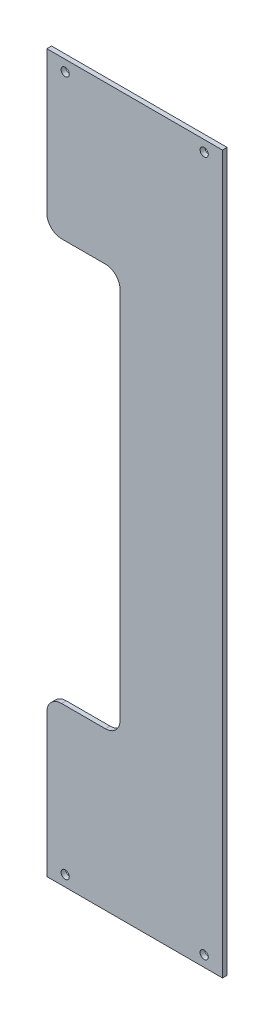
ISO-10303-21;
HEADER;
FILE_DESCRIPTION(('STEP AP214'),'2;1');
FILE_NAME('part.step','',(''),(''),'','','');
FILE_SCHEMA(('AUTOMOTIVE_DESIGN { 1 0 10303 214 1 1 1 1 }'));
ENDSEC;
DATA;
#1=APPLICATION_CONTEXT('core data for automotive mechanical design processes');
#2=APPLICATION_PROTOCOL_DEFINITION('international standard','automotive_design',2000,#1);
#3=PRODUCT_CONTEXT('',#1,'mechanical');
#4=PRODUCT('Part','Part','',(#3));
#5=PRODUCT_RELATED_PRODUCT_CATEGORY('part','',(#4));
#6=PRODUCT_DEFINITION_FORMATION('','',#4);
#7=PRODUCT_DEFINITION_CONTEXT('part definition',#1,'design');
#8=PRODUCT_DEFINITION('design','',#6,#7);
#9=PRODUCT_DEFINITION_SHAPE('','',#8);
#10=(LENGTH_UNIT() NAMED_UNIT(*) SI_UNIT(.MILLI.,.METRE.));
#11=(NAMED_UNIT(*) PLANE_ANGLE_UNIT() SI_UNIT($,.RADIAN.));
#12=(NAMED_UNIT(*) SI_UNIT($,.STERADIAN.) SOLID_ANGLE_UNIT());
#13=UNCERTAINTY_MEASURE_WITH_UNIT(LENGTH_MEASURE(1.E-05),#10,'distance_accuracy_value','');
#14=(GEOMETRIC_REPRESENTATION_CONTEXT(3) GLOBAL_UNCERTAINTY_ASSIGNED_CONTEXT((#13)) GLOBAL_UNIT_ASSIGNED_CONTEXT((#10,
#11,#12)) REPRESENTATION_CONTEXT('',''));
#15=CARTESIAN_POINT('',(0.,0.,0.));
#16=DIRECTION('',(0.,0.,1.));
#17=DIRECTION('',(1.,0.,0.));
#18=AXIS2_PLACEMENT_3D('',#15,#16,#17);
#19=CARTESIAN_POINT('',(-60.,-250.,3.175));
#20=DIRECTION('',(1.,0.,0.));
#21=DIRECTION('',(0.,0.,-1.));
#22=AXIS2_PLACEMENT_3D('',#19,#20,#21);
#23=PLANE('',#22);
#24=DIRECTION('',(0.,-1.,0.));
#25=VECTOR('',#24,1.);
#26=CARTESIAN_POINT('',(-60.,-250.,3.175));
#27=LINE('',#26,#25);
#28=CARTESIAN_POINT('',(-60.,245.,3.175));
#29=VERTEX_POINT('',#28);
#30=CARTESIAN_POINT('',(-60.,147.5,3.175));
#31=VERTEX_POINT('',#30);
#32=EDGE_CURVE('E148',#29,#31,#27,.T.);
#33=ORIENTED_EDGE('',*,*,#32,.F.);
#34=DIRECTION('',(0.,0.,1.));
#35=VECTOR('',#34,1.);
#36=CARTESIAN_POINT('',(-60.,245.,0.));
#37=LINE('',#36,#35);
#38=CARTESIAN_POINT('',(-60.,245.,0.));
#39=VERTEX_POINT('',#38);
#40=EDGE_CURVE('E135',#39,#29,#37,.T.);
#41=ORIENTED_EDGE('',*,*,#40,.F.);
#42=DIRECTION('',(0.,-1.,0.));
#43=VECTOR('',#42,1.);
#44=CARTESIAN_POINT('',(-60.,-250.,0.));
#45=LINE('',#44,#43);
#46=CARTESIAN_POINT('',(-60.,147.5,0.));
#47=VERTEX_POINT('',#46);
#48=EDGE_CURVE('E146',#39,#47,#45,.T.);
#49=ORIENTED_EDGE('',*,*,#48,.T.);
#50=DIRECTION('',(0.,0.,1.));
#51=VECTOR('',#50,1.);
#52=CARTESIAN_POINT('',(-60.,147.5,3.175));
#53=LINE('',#52,#51);
#54=EDGE_CURVE('E185',#47,#31,#53,.T.);
#55=ORIENTED_EDGE('',*,*,#54,.T.);
#56=EDGE_LOOP('',(#33,#41,#49,#55));
#57=FACE_BOUND('',#56,.T.);
#58=ADVANCED_FACE('F45',(#57),#23,.F.);
#59=CARTESIAN_POINT('',(0.,0.,3.175));
#60=DIRECTION('',(0.,0.,-1.));
#61=DIRECTION('',(-1.,0.,0.));
#62=AXIS2_PLACEMENT_3D('',#59,#60,#61);
#63=PLANE('',#62);
#64=DIRECTION('',(0.,1.,0.));
#65=VECTOR('',#64,1.);
#66=CARTESIAN_POINT('',(60.,-250.,3.175));
#67=LINE('',#66,#65);
#68=CARTESIAN_POINT('',(60.,-245.,3.175));
#69=VERTEX_POINT('',#68);
#70=CARTESIAN_POINT('',(60.,245.,3.175));
#71=VERTEX_POINT('',#70);
#72=EDGE_CURVE('E168',#69,#71,#67,.T.);
#73=ORIENTED_EDGE('',*,*,#72,.T.);
#74=DIRECTION('',(1.,0.,0.));
#75=VECTOR('',#74,1.);
#76=CARTESIAN_POINT('',(-60.,245.,3.175));
#77=LINE('',#76,#75);
#78=EDGE_CURVE('E61',#29,#71,#77,.T.);
#79=ORIENTED_EDGE('',*,*,#78,.F.);
#80=ORIENTED_EDGE('',*,*,#32,.T.);
#81=CARTESIAN_POINT('',(-50.,147.5,3.175));
#82=DIRECTION('',(0.,0.,-1.));
#83=DIRECTION('',(-1.,0.,0.));
#84=AXIS2_PLACEMENT_3D('',#81,#82,#83);
#85=CIRCLE('',#84,10.);
#86=CARTESIAN_POINT('',(-50.,137.5,3.175));
#87=VERTEX_POINT('',#86);
#88=EDGE_CURVE('E191',#31,#87,#85,.F.);
#89=ORIENTED_EDGE('',*,*,#88,.T.);
#90=DIRECTION('',(-1.,0.,0.));
#91=VECTOR('',#90,1.);
#92=CARTESIAN_POINT('',(-60.,137.5,3.175));
#93=LINE('',#92,#91);
#94=CARTESIAN_POINT('',(-20.,137.5,3.175));
#95=VERTEX_POINT('',#94);
#96=EDGE_CURVE('E252',#95,#87,#93,.T.);
#97=ORIENTED_EDGE('',*,*,#96,.F.);
#98=CARTESIAN_POINT('',(-20.,127.5,3.175));
#99=DIRECTION('',(0.,0.,-1.));
#100=DIRECTION('',(-1.,0.,0.));
#101=AXIS2_PLACEMENT_3D('',#98,#99,#100);
#102=CIRCLE('',#101,10.);
#103=CARTESIAN_POINT('',(-9.99999999999997,127.5,3.175));
#104=VERTEX_POINT('',#103);
#105=EDGE_CURVE('E209',#95,#104,#102,.T.);
#106=ORIENTED_EDGE('',*,*,#105,.T.);
#107=DIRECTION('',(0.,1.,0.));
#108=VECTOR('',#107,1.);
#109=CARTESIAN_POINT('',(-9.99999999999997,137.5,3.175));
#110=LINE('',#109,#108);
#111=CARTESIAN_POINT('',(-9.99999999999995,-127.5,3.175));
#112=VERTEX_POINT('',#111);
#113=EDGE_CURVE('E224',#112,#104,#110,.T.);
#114=ORIENTED_EDGE('',*,*,#113,.F.);
#115=CARTESIAN_POINT('',(-20.,-127.5,3.175));
#116=DIRECTION('',(0.,0.,-1.));
#117=DIRECTION('',(-1.,0.,0.));
#118=AXIS2_PLACEMENT_3D('',#115,#116,#117);
#119=CIRCLE('',#118,10.);
#120=CARTESIAN_POINT('',(-19.9999999999999,-137.5,3.175));
#121=VERTEX_POINT('',#120);
#122=EDGE_CURVE('E54',#112,#121,#119,.T.);
#123=ORIENTED_EDGE('',*,*,#122,.T.);
#124=DIRECTION('',(1.,0.,0.));
#125=VECTOR('',#124,1.);
#126=CARTESIAN_POINT('',(-60.,-137.5,3.175));
#127=LINE('',#126,#125);
#128=CARTESIAN_POINT('',(-50.,-137.5,3.175));
#129=VERTEX_POINT('',#128);
#130=EDGE_CURVE('E222',#129,#121,#127,.T.);
#131=ORIENTED_EDGE('',*,*,#130,.F.);
#132=CARTESIAN_POINT('',(-50.,-147.5,3.175));
#133=DIRECTION('',(0.,0.,-1.));
#134=DIRECTION('',(-1.,0.,0.));
#135=AXIS2_PLACEMENT_3D('',#132,#133,#134);
#136=CIRCLE('',#135,10.);
#137=CARTESIAN_POINT('',(-60.,-147.5,3.175));
#138=VERTEX_POINT('',#137);
#139=EDGE_CURVE('E188',#129,#138,#136,.F.);
#140=ORIENTED_EDGE('',*,*,#139,.T.);
#141=CARTESIAN_POINT('',(-60.,-245.,3.175));
#142=VERTEX_POINT('',#141);
#143=EDGE_CURVE('E163',#138,#142,#27,.T.);
#144=ORIENTED_EDGE('',*,*,#143,.T.);
#145=DIRECTION('',(-1.,0.,0.));
#146=VECTOR('',#145,1.);
#147=CARTESIAN_POINT('',(-60.,-245.,3.175));
#148=LINE('',#147,#146);
#149=EDGE_CURVE('E297',#69,#142,#148,.T.);
#150=ORIENTED_EDGE('',*,*,#149,.F.);
#151=EDGE_LOOP('',(#73,#79,#80,#89,#97,#106,#114,#123,#131,#140,#144,#150));
#152=FACE_BOUND('',#151,.T.);
#153=CARTESIAN_POINT('',(-47.5,-237.5,3.175));
#154=DIRECTION('',(0.,0.,1.));
#155=DIRECTION('',(1.,0.,0.));
#156=AXIS2_PLACEMENT_3D('',#153,#154,#155);
#157=CIRCLE('',#156,2.8);
#158=CARTESIAN_POINT('',(-44.7,-237.5,3.175));
#159=VERTEX_POINT('',#158);
#160=EDGE_CURVE('E166',#159,#159,#157,.T.);
#161=ORIENTED_EDGE('',*,*,#160,.F.);
#162=EDGE_LOOP('',(#161));
#163=FACE_BOUND('',#162,.T.);
#164=CARTESIAN_POINT('',(47.5,-237.5,3.175));
#165=DIRECTION('',(0.,0.,1.));
#166=DIRECTION('',(1.,0.,0.));
#167=AXIS2_PLACEMENT_3D('',#164,#165,#166);
#168=CIRCLE('',#167,2.8);
#169=CARTESIAN_POINT('',(50.3,-237.5,3.175));
#170=VERTEX_POINT('',#169);
#171=EDGE_CURVE('E277',#170,#170,#168,.T.);
#172=ORIENTED_EDGE('',*,*,#171,.F.);
#173=EDGE_LOOP('',(#172));
#174=FACE_BOUND('',#173,.T.);
#175=CARTESIAN_POINT('',(-47.5,237.5,3.175));
#176=DIRECTION('',(0.,0.,1.));
#177=DIRECTION('',(1.,0.,0.));
#178=AXIS2_PLACEMENT_3D('',#175,#176,#177);
#179=CIRCLE('',#178,2.8);
#180=CARTESIAN_POINT('',(-44.7,237.5,3.175));
#181=VERTEX_POINT('',#180);
#182=EDGE_CURVE('E269',#181,#181,#179,.T.);
#183=ORIENTED_EDGE('',*,*,#182,.F.);
#184=EDGE_LOOP('',(#183));
#185=FACE_BOUND('',#184,.T.);
#186=CARTESIAN_POINT('',(47.5,237.5,3.175));
#187=DIRECTION('',(0.,0.,1.));
#188=DIRECTION('',(1.,0.,0.));
#189=AXIS2_PLACEMENT_3D('',#186,#187,#188);
#190=CIRCLE('',#189,2.8);
#191=CARTESIAN_POINT('',(50.3,237.5,3.175));
#192=VERTEX_POINT('',#191);
#193=EDGE_CURVE('E261',#192,#192,#190,.T.);
#194=ORIENTED_EDGE('',*,*,#193,.F.);
#195=EDGE_LOOP('',(#194));
#196=FACE_BOUND('',#195,.T.);
#197=ADVANCED_FACE('F220',(#152,#163,#174,#185,#196),#63,.F.);
#198=CARTESIAN_POINT('',(0.,0.,0.));
#199=DIRECTION('',(0.,0.,-1.));
#200=DIRECTION('',(-1.,0.,0.));
#201=AXIS2_PLACEMENT_3D('',#198,#199,#200);
#202=PLANE('',#201);
#203=DIRECTION('',(1.,0.,0.));
#204=VECTOR('',#203,1.);
#205=CARTESIAN_POINT('',(-60.,245.,0.));
#206=LINE('',#205,#204);
#207=CARTESIAN_POINT('',(60.,245.,0.));
#208=VERTEX_POINT('',#207);
#209=EDGE_CURVE('E132',#39,#208,#206,.T.);
#210=ORIENTED_EDGE('',*,*,#209,.T.);
#211=DIRECTION('',(0.,1.,0.));
#212=VECTOR('',#211,1.);
#213=CARTESIAN_POINT('',(60.,-250.,0.));
#214=LINE('',#213,#212);
#215=CARTESIAN_POINT('',(60.,-245.,0.));
#216=VERTEX_POINT('',#215);
#217=EDGE_CURVE('E158',#216,#208,#214,.T.);
#218=ORIENTED_EDGE('',*,*,#217,.F.);
#219=DIRECTION('',(-1.,0.,0.));
#220=VECTOR('',#219,1.);
#221=CARTESIAN_POINT('',(-60.,-245.,0.));
#222=LINE('',#221,#220);
#223=CARTESIAN_POINT('',(-60.,-245.,0.));
#224=VERTEX_POINT('',#223);
#225=EDGE_CURVE('E69',#216,#224,#222,.T.);
#226=ORIENTED_EDGE('',*,*,#225,.T.);
#227=CARTESIAN_POINT('',(-60.,-147.5,0.));
#228=VERTEX_POINT('',#227);
#229=EDGE_CURVE('E159',#228,#224,#45,.T.);
#230=ORIENTED_EDGE('',*,*,#229,.F.);
#231=CARTESIAN_POINT('',(-50.,-147.5,0.));
#232=DIRECTION('',(0.,0.,-1.));
#233=DIRECTION('',(-1.,0.,0.));
#234=AXIS2_PLACEMENT_3D('',#231,#232,#233);
#235=CIRCLE('',#234,10.);
#236=CARTESIAN_POINT('',(-50.,-137.5,0.));
#237=VERTEX_POINT('',#236);
#238=EDGE_CURVE('E194',#228,#237,#235,.T.);
#239=ORIENTED_EDGE('',*,*,#238,.T.);
#240=DIRECTION('',(1.,0.,0.));
#241=VECTOR('',#240,1.);
#242=CARTESIAN_POINT('',(-60.,-137.5,0.));
#243=LINE('',#242,#241);
#244=CARTESIAN_POINT('',(-19.9999999999999,-137.5,0.));
#245=VERTEX_POINT('',#244);
#246=EDGE_CURVE('E241',#237,#245,#243,.T.);
#247=ORIENTED_EDGE('',*,*,#246,.T.);
#248=CARTESIAN_POINT('',(-20.,-127.5,0.));
#249=DIRECTION('',(0.,0.,-1.));
#250=DIRECTION('',(-1.,0.,0.));
#251=AXIS2_PLACEMENT_3D('',#248,#249,#250);
#252=CIRCLE('',#251,10.);
#253=CARTESIAN_POINT('',(-9.99999999999995,-127.5,0.));
#254=VERTEX_POINT('',#253);
#255=EDGE_CURVE('E11',#245,#254,#252,.F.);
#256=ORIENTED_EDGE('',*,*,#255,.T.);
#257=DIRECTION('',(0.,1.,0.));
#258=VECTOR('',#257,1.);
#259=CARTESIAN_POINT('',(-9.99999999999997,137.5,0.));
#260=LINE('',#259,#258);
#261=CARTESIAN_POINT('',(-9.99999999999997,127.5,0.));
#262=VERTEX_POINT('',#261);
#263=EDGE_CURVE('E239',#254,#262,#260,.T.);
#264=ORIENTED_EDGE('',*,*,#263,.T.);
#265=CARTESIAN_POINT('',(-20.,127.5,0.));
#266=DIRECTION('',(0.,0.,-1.));
#267=DIRECTION('',(-1.,0.,0.));
#268=AXIS2_PLACEMENT_3D('',#265,#266,#267);
#269=CIRCLE('',#268,10.);
#270=CARTESIAN_POINT('',(-20.,137.5,0.));
#271=VERTEX_POINT('',#270);
#272=EDGE_CURVE('E212',#262,#271,#269,.F.);
#273=ORIENTED_EDGE('',*,*,#272,.T.);
#274=DIRECTION('',(-1.,0.,0.));
#275=VECTOR('',#274,1.);
#276=CARTESIAN_POINT('',(-60.,137.5,0.));
#277=LINE('',#276,#275);
#278=CARTESIAN_POINT('',(-50.,137.5,0.));
#279=VERTEX_POINT('',#278);
#280=EDGE_CURVE('E246',#271,#279,#277,.T.);
#281=ORIENTED_EDGE('',*,*,#280,.T.);
#282=CARTESIAN_POINT('',(-50.,147.5,0.));
#283=DIRECTION('',(0.,0.,-1.));
#284=DIRECTION('',(-1.,0.,0.));
#285=AXIS2_PLACEMENT_3D('',#282,#283,#284);
#286=CIRCLE('',#285,10.);
#287=EDGE_CURVE('E155',#279,#47,#286,.T.);
#288=ORIENTED_EDGE('',*,*,#287,.T.);
#289=ORIENTED_EDGE('',*,*,#48,.F.);
#290=EDGE_LOOP('',(#210,#218,#226,#230,#239,#247,#256,#264,#273,#281,#288,#289));
#291=FACE_BOUND('',#290,.T.);
#292=CARTESIAN_POINT('',(-47.5,237.5,0.));
#293=DIRECTION('',(0.,0.,1.));
#294=DIRECTION('',(1.,0.,0.));
#295=AXIS2_PLACEMENT_3D('',#292,#293,#294);
#296=CIRCLE('',#295,2.8);
#297=CARTESIAN_POINT('',(-44.7,237.5,0.));
#298=VERTEX_POINT('',#297);
#299=EDGE_CURVE('E265',#298,#298,#296,.T.);
#300=ORIENTED_EDGE('',*,*,#299,.T.);
#301=EDGE_LOOP('',(#300));
#302=FACE_BOUND('',#301,.T.);
#303=CARTESIAN_POINT('',(-47.5,-237.5,0.));
#304=DIRECTION('',(0.,0.,1.));
#305=DIRECTION('',(1.,0.,0.));
#306=AXIS2_PLACEMENT_3D('',#303,#304,#305);
#307=CIRCLE('',#306,2.8);
#308=CARTESIAN_POINT('',(-44.7,-237.5,0.));
#309=VERTEX_POINT('',#308);
#310=EDGE_CURVE('E281',#309,#309,#307,.T.);
#311=ORIENTED_EDGE('',*,*,#310,.T.);
#312=EDGE_LOOP('',(#311));
#313=FACE_BOUND('',#312,.T.);
#314=CARTESIAN_POINT('',(47.5,-237.5,0.));
#315=DIRECTION('',(0.,0.,1.));
#316=DIRECTION('',(1.,0.,0.));
#317=AXIS2_PLACEMENT_3D('',#314,#315,#316);
#318=CIRCLE('',#317,2.8);
#319=CARTESIAN_POINT('',(50.3,-237.5,0.));
#320=VERTEX_POINT('',#319);
#321=EDGE_CURVE('E273',#320,#320,#318,.T.);
#322=ORIENTED_EDGE('',*,*,#321,.T.);
#323=EDGE_LOOP('',(#322));
#324=FACE_BOUND('',#323,.T.);
#325=CARTESIAN_POINT('',(47.5,237.5,0.));
#326=DIRECTION('',(0.,0.,1.));
#327=DIRECTION('',(1.,0.,0.));
#328=AXIS2_PLACEMENT_3D('',#325,#326,#327);
#329=CIRCLE('',#328,2.8);
#330=CARTESIAN_POINT('',(50.3,237.5,0.));
#331=VERTEX_POINT('',#330);
#332=EDGE_CURVE('E250',#331,#331,#329,.T.);
#333=ORIENTED_EDGE('',*,*,#332,.T.);
#334=EDGE_LOOP('',(#333));
#335=FACE_BOUND('',#334,.T.);
#336=ADVANCED_FACE('F151',(#291,#302,#313,#324,#335),#202,.T.);
#337=ORIENTED_EDGE('',*,*,#229,.T.);
#338=DIRECTION('',(0.,0.,1.));
#339=VECTOR('',#338,1.);
#340=CARTESIAN_POINT('',(-60.,-245.,0.));
#341=LINE('',#340,#339);
#342=EDGE_CURVE('E304',#224,#142,#341,.T.);
#343=ORIENTED_EDGE('',*,*,#342,.T.);
#344=ORIENTED_EDGE('',*,*,#143,.F.);
#345=DIRECTION('',(0.,0.,1.));
#346=VECTOR('',#345,1.);
#347=CARTESIAN_POINT('',(-60.,-147.5,3.175));
#348=LINE('',#347,#346);
#349=EDGE_CURVE('E206',#138,#228,#348,.F.);
#350=ORIENTED_EDGE('',*,*,#349,.T.);
#351=EDGE_LOOP('',(#337,#343,#344,#350));
#352=FACE_BOUND('',#351,.T.);
#353=ADVANCED_FACE('F302',(#352),#23,.F.);
#354=CARTESIAN_POINT('',(60.,-250.,3.175));
#355=DIRECTION('',(-1.,0.,0.));
#356=DIRECTION('',(0.,0.,1.));
#357=AXIS2_PLACEMENT_3D('',#354,#355,#356);
#358=PLANE('',#357);
#359=ORIENTED_EDGE('',*,*,#217,.T.);
#360=DIRECTION('',(0.,0.,1.));
#361=VECTOR('',#360,1.);
#362=CARTESIAN_POINT('',(60.,245.,0.));
#363=LINE('',#362,#361);
#364=EDGE_CURVE('E136',#208,#71,#363,.T.);
#365=ORIENTED_EDGE('',*,*,#364,.T.);
#366=ORIENTED_EDGE('',*,*,#72,.F.);
#367=DIRECTION('',(0.,0.,1.));
#368=VECTOR('',#367,1.);
#369=CARTESIAN_POINT('',(60.,-245.,0.));
#370=LINE('',#369,#368);
#371=EDGE_CURVE('E308',#216,#69,#370,.T.);
#372=ORIENTED_EDGE('',*,*,#371,.F.);
#373=EDGE_LOOP('',(#359,#365,#366,#372));
#374=FACE_BOUND('',#373,.T.);
#375=ADVANCED_FACE('F320',(#374),#358,.F.);
#376=CARTESIAN_POINT('',(-47.5,-237.5,3.175));
#377=DIRECTION('',(0.,0.,-1.));
#378=DIRECTION('',(-1.,0.,0.));
#379=AXIS2_PLACEMENT_3D('',#376,#377,#378);
#380=CYLINDRICAL_SURFACE('',#379,2.8);
#381=ORIENTED_EDGE('',*,*,#160,.T.);
#382=EDGE_LOOP('',(#381));
#383=FACE_BOUND('',#382,.T.);
#384=ORIENTED_EDGE('',*,*,#310,.F.);
#385=EDGE_LOOP('',(#384));
#386=FACE_BOUND('',#385,.T.);
#387=ADVANCED_FACE('F343',(#383,#386),#380,.F.);
#388=CARTESIAN_POINT('',(47.5,-237.5,3.175));
#389=DIRECTION('',(0.,0.,-1.));
#390=DIRECTION('',(-1.,0.,0.));
#391=AXIS2_PLACEMENT_3D('',#388,#389,#390);
#392=CYLINDRICAL_SURFACE('',#391,2.8);
#393=ORIENTED_EDGE('',*,*,#171,.T.);
#394=EDGE_LOOP('',(#393));
#395=FACE_BOUND('',#394,.T.);
#396=ORIENTED_EDGE('',*,*,#321,.F.);
#397=EDGE_LOOP('',(#396));
#398=FACE_BOUND('',#397,.T.);
#399=ADVANCED_FACE('F350',(#395,#398),#392,.F.);
#400=CARTESIAN_POINT('',(-47.5,237.5,3.175));
#401=DIRECTION('',(0.,0.,-1.));
#402=DIRECTION('',(-1.,0.,0.));
#403=AXIS2_PLACEMENT_3D('',#400,#401,#402);
#404=CYLINDRICAL_SURFACE('',#403,2.8);
#405=ORIENTED_EDGE('',*,*,#182,.T.);
#406=EDGE_LOOP('',(#405));
#407=FACE_BOUND('',#406,.T.);
#408=ORIENTED_EDGE('',*,*,#299,.F.);
#409=EDGE_LOOP('',(#408));
#410=FACE_BOUND('',#409,.T.);
#411=ADVANCED_FACE('F354',(#407,#410),#404,.F.);
#412=CARTESIAN_POINT('',(47.5,237.5,3.175));
#413=DIRECTION('',(0.,0.,-1.));
#414=DIRECTION('',(-1.,0.,0.));
#415=AXIS2_PLACEMENT_3D('',#412,#413,#414);
#416=CYLINDRICAL_SURFACE('',#415,2.8);
#417=ORIENTED_EDGE('',*,*,#193,.T.);
#418=EDGE_LOOP('',(#417));
#419=FACE_BOUND('',#418,.T.);
#420=ORIENTED_EDGE('',*,*,#332,.F.);
#421=EDGE_LOOP('',(#420));
#422=FACE_BOUND('',#421,.T.);
#423=ADVANCED_FACE('F358',(#419,#422),#416,.F.);
#424=CARTESIAN_POINT('',(-60.,137.5,0.));
#425=DIRECTION('',(0.,1.,0.));
#426=DIRECTION('',(0.,0.,1.));
#427=AXIS2_PLACEMENT_3D('',#424,#425,#426);
#428=PLANE('',#427);
#429=ORIENTED_EDGE('',*,*,#280,.F.);
#430=DIRECTION('',(0.,0.,1.));
#431=VECTOR('',#430,1.);
#432=CARTESIAN_POINT('',(-20.,137.5,3.175));
#433=LINE('',#432,#431);
#434=EDGE_CURVE('E174',#271,#95,#433,.T.);
#435=ORIENTED_EDGE('',*,*,#434,.T.);
#436=ORIENTED_EDGE('',*,*,#96,.T.);
#437=DIRECTION('',(0.,0.,1.));
#438=VECTOR('',#437,1.);
#439=CARTESIAN_POINT('',(-50.,137.5,0.));
#440=LINE('',#439,#438);
#441=EDGE_CURVE('E171',#87,#279,#440,.F.);
#442=ORIENTED_EDGE('',*,*,#441,.T.);
#443=EDGE_LOOP('',(#429,#435,#436,#442));
#444=FACE_BOUND('',#443,.T.);
#445=ADVANCED_FACE('F362',(#444),#428,.F.);
#446=CARTESIAN_POINT('',(-9.99999999999997,137.5,0.));
#447=DIRECTION('',(1.,0.,0.));
#448=DIRECTION('',(0.,1.,0.));
#449=AXIS2_PLACEMENT_3D('',#446,#447,#448);
#450=PLANE('',#449);
#451=ORIENTED_EDGE('',*,*,#113,.T.);
#452=DIRECTION('',(0.,0.,1.));
#453=VECTOR('',#452,1.);
#454=CARTESIAN_POINT('',(-9.99999999999997,127.5,0.));
#455=LINE('',#454,#453);
#456=EDGE_CURVE('E182',#104,#262,#455,.F.);
#457=ORIENTED_EDGE('',*,*,#456,.T.);
#458=ORIENTED_EDGE('',*,*,#263,.F.);
#459=DIRECTION('',(0.,0.,1.));
#460=VECTOR('',#459,1.);
#461=CARTESIAN_POINT('',(-9.99999999999995,-127.5,3.175));
#462=LINE('',#461,#460);
#463=EDGE_CURVE('E178',#254,#112,#462,.T.);
#464=ORIENTED_EDGE('',*,*,#463,.T.);
#465=EDGE_LOOP('',(#451,#457,#458,#464));
#466=FACE_BOUND('',#465,.T.);
#467=ADVANCED_FACE('F243',(#466),#450,.F.);
#468=CARTESIAN_POINT('',(-60.,-137.5,0.));
#469=DIRECTION('',(0.,-1.,0.));
#470=DIRECTION('',(0.,0.,-1.));
#471=AXIS2_PLACEMENT_3D('',#468,#469,#470);
#472=PLANE('',#471);
#473=ORIENTED_EDGE('',*,*,#130,.T.);
#474=DIRECTION('',(0.,0.,1.));
#475=VECTOR('',#474,1.);
#476=CARTESIAN_POINT('',(-20.,-137.5,0.));
#477=LINE('',#476,#475);
#478=EDGE_CURVE('E203',#121,#245,#477,.F.);
#479=ORIENTED_EDGE('',*,*,#478,.T.);
#480=ORIENTED_EDGE('',*,*,#246,.F.);
#481=DIRECTION('',(0.,0.,1.));
#482=VECTOR('',#481,1.);
#483=CARTESIAN_POINT('',(-50.,-137.5,0.));
#484=LINE('',#483,#482);
#485=EDGE_CURVE('E199',#237,#129,#484,.T.);
#486=ORIENTED_EDGE('',*,*,#485,.T.);
#487=EDGE_LOOP('',(#473,#479,#480,#486));
#488=FACE_BOUND('',#487,.T.);
#489=ADVANCED_FACE('F229',(#488),#472,.F.);
#490=CARTESIAN_POINT('',(-20.,127.5,0.));
#491=DIRECTION('',(0.,0.,-1.));
#492=DIRECTION('',(-1.,0.,0.));
#493=AXIS2_PLACEMENT_3D('',#490,#491,#492);
#494=CYLINDRICAL_SURFACE('',#493,10.);
#495=ORIENTED_EDGE('',*,*,#272,.F.);
#496=ORIENTED_EDGE('',*,*,#456,.F.);
#497=ORIENTED_EDGE('',*,*,#105,.F.);
#498=ORIENTED_EDGE('',*,*,#434,.F.);
#499=EDGE_LOOP('',(#495,#496,#497,#498));
#500=FACE_BOUND('',#499,.T.);
#501=ADVANCED_FACE('F366',(#500),#494,.F.);
#502=CARTESIAN_POINT('',(-50.,147.5,3.175));
#503=DIRECTION('',(0.,0.,1.));
#504=DIRECTION('',(1.,0.,0.));
#505=AXIS2_PLACEMENT_3D('',#502,#503,#504);
#506=CYLINDRICAL_SURFACE('',#505,10.);
#507=ORIENTED_EDGE('',*,*,#287,.F.);
#508=ORIENTED_EDGE('',*,*,#441,.F.);
#509=ORIENTED_EDGE('',*,*,#88,.F.);
#510=ORIENTED_EDGE('',*,*,#54,.F.);
#511=EDGE_LOOP('',(#507,#508,#509,#510));
#512=FACE_BOUND('',#511,.T.);
#513=ADVANCED_FACE('F378',(#512),#506,.T.);
#514=CARTESIAN_POINT('',(-20.,-127.5,0.));
#515=DIRECTION('',(0.,0.,-1.));
#516=DIRECTION('',(-1.,0.,0.));
#517=AXIS2_PLACEMENT_3D('',#514,#515,#516);
#518=CYLINDRICAL_SURFACE('',#517,10.);
#519=ORIENTED_EDGE('',*,*,#255,.F.);
#520=ORIENTED_EDGE('',*,*,#478,.F.);
#521=ORIENTED_EDGE('',*,*,#122,.F.);
#522=ORIENTED_EDGE('',*,*,#463,.F.);
#523=EDGE_LOOP('',(#519,#520,#521,#522));
#524=FACE_BOUND('',#523,.T.);
#525=ADVANCED_FACE('F236',(#524),#518,.F.);
#526=CARTESIAN_POINT('',(-50.,-147.5,0.));
#527=DIRECTION('',(0.,0.,1.));
#528=DIRECTION('',(1.,0.,0.));
#529=AXIS2_PLACEMENT_3D('',#526,#527,#528);
#530=CYLINDRICAL_SURFACE('',#529,10.);
#531=ORIENTED_EDGE('',*,*,#238,.F.);
#532=ORIENTED_EDGE('',*,*,#349,.F.);
#533=ORIENTED_EDGE('',*,*,#139,.F.);
#534=ORIENTED_EDGE('',*,*,#485,.F.);
#535=EDGE_LOOP('',(#531,#532,#533,#534));
#536=FACE_BOUND('',#535,.T.);
#537=ADVANCED_FACE('F47',(#536),#530,.T.);
#538=CARTESIAN_POINT('',(-60.,-245.,0.));
#539=DIRECTION('',(0.,1.,0.));
#540=DIRECTION('',(0.,0.,1.));
#541=AXIS2_PLACEMENT_3D('',#538,#539,#540);
#542=PLANE('',#541);
#543=ORIENTED_EDGE('',*,*,#149,.T.);
#544=ORIENTED_EDGE('',*,*,#342,.F.);
#545=ORIENTED_EDGE('',*,*,#225,.F.);
#546=ORIENTED_EDGE('',*,*,#371,.T.);
#547=EDGE_LOOP('',(#543,#544,#545,#546));
#548=FACE_BOUND('',#547,.T.);
#549=ADVANCED_FACE('F321',(#548),#542,.F.);
#550=CARTESIAN_POINT('',(-60.,245.,0.));
#551=DIRECTION('',(0.,-1.,0.));
#552=DIRECTION('',(0.,0.,-1.));
#553=AXIS2_PLACEMENT_3D('',#550,#551,#552);
#554=PLANE('',#553);
#555=ORIENTED_EDGE('',*,*,#78,.T.);
#556=ORIENTED_EDGE('',*,*,#364,.F.);
#557=ORIENTED_EDGE('',*,*,#209,.F.);
#558=ORIENTED_EDGE('',*,*,#40,.T.);
#559=EDGE_LOOP('',(#555,#556,#557,#558));
#560=FACE_BOUND('',#559,.T.);
#561=ADVANCED_FACE('F134',(#560),#554,.F.);
#562=CLOSED_SHELL('',(#58,#197,#336,#353,#375,#387,#399,#411,#423,#445,#467,#489,#501,#513,#525,
#537,#549,#561));
#563=MANIFOLD_SOLID_BREP('B2',#562);
#564=ADVANCED_BREP_SHAPE_REPRESENTATION('',(#18,#563),#14);
#565=SHAPE_DEFINITION_REPRESENTATION(#9,#564);
ENDSEC;
END-ISO-10303-21;
